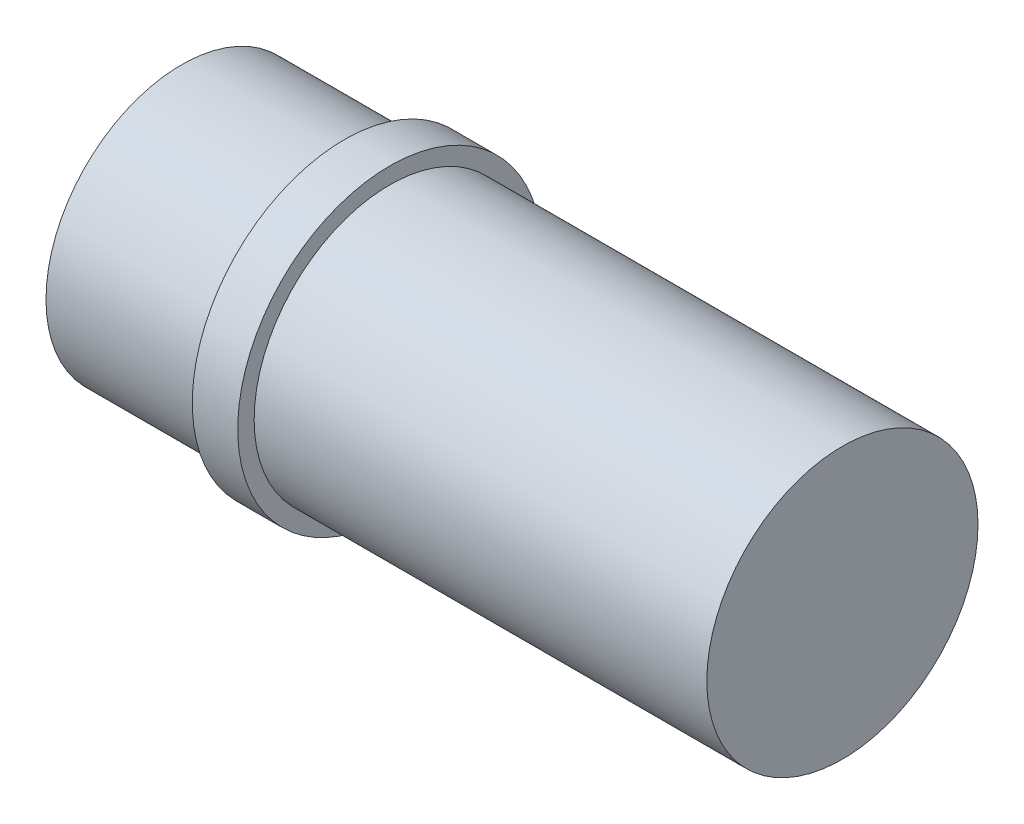
ISO-10303-21;
HEADER;
FILE_DESCRIPTION(('STEP AP214'),'2;1');
FILE_NAME('part.step','',(''),(''),'','','');
FILE_SCHEMA(('AUTOMOTIVE_DESIGN { 1 0 10303 214 1 1 1 1 }'));
ENDSEC;
DATA;
#1=APPLICATION_CONTEXT('core data for automotive mechanical design processes');
#2=APPLICATION_PROTOCOL_DEFINITION('international standard','automotive_design',2000,#1);
#3=PRODUCT_CONTEXT('',#1,'mechanical');
#4=PRODUCT('Part','Part','',(#3));
#5=PRODUCT_RELATED_PRODUCT_CATEGORY('part','',(#4));
#6=PRODUCT_DEFINITION_FORMATION('','',#4);
#7=PRODUCT_DEFINITION_CONTEXT('part definition',#1,'design');
#8=PRODUCT_DEFINITION('design','',#6,#7);
#9=PRODUCT_DEFINITION_SHAPE('','',#8);
#10=(LENGTH_UNIT() NAMED_UNIT(*) SI_UNIT(.MILLI.,.METRE.));
#11=(NAMED_UNIT(*) PLANE_ANGLE_UNIT() SI_UNIT($,.RADIAN.));
#12=(NAMED_UNIT(*) SI_UNIT($,.STERADIAN.) SOLID_ANGLE_UNIT());
#13=UNCERTAINTY_MEASURE_WITH_UNIT(LENGTH_MEASURE(1.E-05),#10,'distance_accuracy_value','');
#14=(GEOMETRIC_REPRESENTATION_CONTEXT(3) GLOBAL_UNCERTAINTY_ASSIGNED_CONTEXT((#13)) GLOBAL_UNIT_ASSIGNED_CONTEXT((#10,
#11,#12)) REPRESENTATION_CONTEXT('',''));
#15=CARTESIAN_POINT('',(0.,0.,0.));
#16=DIRECTION('',(0.,0.,1.));
#17=DIRECTION('',(1.,0.,0.));
#18=AXIS2_PLACEMENT_3D('',#15,#16,#17);
#19=CARTESIAN_POINT('',(29.245125,0.,0.));
#20=DIRECTION('',(-1.,0.,0.));
#21=DIRECTION('',(0.,0.,1.));
#22=AXIS2_PLACEMENT_3D('',#19,#20,#21);
#23=CYLINDRICAL_SURFACE('',#22,36.241875);
#24=CARTESIAN_POINT('',(29.245125,0.,0.));
#25=DIRECTION('',(1.,0.,0.));
#26=DIRECTION('',(0.,0.,-1.));
#27=AXIS2_PLACEMENT_3D('',#24,#25,#26);
#28=CIRCLE('',#27,36.241875);
#29=CARTESIAN_POINT('',(29.245125,0.,-36.241875));
#30=VERTEX_POINT('',#29);
#31=EDGE_CURVE('E40',#30,#30,#28,.T.);
#32=ORIENTED_EDGE('',*,*,#31,.F.);
#33=EDGE_LOOP('',(#32));
#34=FACE_BOUND('',#33,.T.);
#35=CARTESIAN_POINT('',(-14.245125,0.,0.));
#36=DIRECTION('',(1.,0.,0.));
#37=DIRECTION('',(0.,0.,-1.));
#38=AXIS2_PLACEMENT_3D('',#35,#36,#37);
#39=CIRCLE('',#38,36.241875);
#40=CARTESIAN_POINT('',(-14.245125,0.,-36.241875));
#41=VERTEX_POINT('',#40);
#42=EDGE_CURVE('E36',#41,#41,#39,.T.);
#43=ORIENTED_EDGE('',*,*,#42,.T.);
#44=EDGE_LOOP('',(#43));
#45=FACE_BOUND('',#44,.T.);
#46=ADVANCED_FACE('F33',(#34,#45),#23,.T.);
#47=CARTESIAN_POINT('',(-14.245125,0.,0.));
#48=DIRECTION('',(1.,0.,0.));
#49=DIRECTION('',(0.,0.,-1.));
#50=AXIS2_PLACEMENT_3D('',#47,#48,#49);
#51=PLANE('',#50);
#52=ORIENTED_EDGE('',*,*,#42,.F.);
#53=EDGE_LOOP('',(#52));
#54=FACE_BOUND('',#53,.T.);
#55=ADVANCED_FACE('F74',(#54),#51,.F.);
#56=CARTESIAN_POINT('',(41.3951174,0.,0.));
#57=DIRECTION('',(-1.,0.,0.));
#58=DIRECTION('',(0.,0.,1.));
#59=AXIS2_PLACEMENT_3D('',#56,#57,#58);
#60=CYLINDRICAL_SURFACE('',#59,40.6333777221703);
#61=CARTESIAN_POINT('',(41.3951174,0.,0.));
#62=DIRECTION('',(1.,0.,0.));
#63=DIRECTION('',(0.,0.,-1.));
#64=AXIS2_PLACEMENT_3D('',#61,#62,#63);
#65=CIRCLE('',#64,40.6333777221703);
#66=CARTESIAN_POINT('',(41.3951174,0.,-40.6333777221703));
#67=VERTEX_POINT('',#66);
#68=EDGE_CURVE('E48',#67,#67,#65,.T.);
#69=ORIENTED_EDGE('',*,*,#68,.F.);
#70=EDGE_LOOP('',(#69));
#71=FACE_BOUND('',#70,.T.);
#72=CARTESIAN_POINT('',(29.245125,0.,0.));
#73=DIRECTION('',(1.,0.,0.));
#74=DIRECTION('',(0.,0.,-1.));
#75=AXIS2_PLACEMENT_3D('',#72,#73,#74);
#76=CIRCLE('',#75,40.6333777221703);
#77=CARTESIAN_POINT('',(29.245125,0.,-40.6333777221703));
#78=VERTEX_POINT('',#77);
#79=EDGE_CURVE('E51',#78,#78,#76,.T.);
#80=ORIENTED_EDGE('',*,*,#79,.T.);
#81=EDGE_LOOP('',(#80));
#82=FACE_BOUND('',#81,.T.);
#83=ADVANCED_FACE('F79',(#71,#82),#60,.T.);
#84=CARTESIAN_POINT('',(41.3951174,0.,0.));
#85=DIRECTION('',(1.,0.,0.));
#86=DIRECTION('',(0.,0.,-1.));
#87=AXIS2_PLACEMENT_3D('',#84,#85,#86);
#88=PLANE('',#87);
#89=CARTESIAN_POINT('',(41.3951174,0.,0.));
#90=DIRECTION('',(1.,0.,0.));
#91=DIRECTION('',(0.,0.,-1.));
#92=AXIS2_PLACEMENT_3D('',#89,#90,#91);
#93=CIRCLE('',#92,36.241875);
#94=CARTESIAN_POINT('',(41.3951174,0.,-36.241875));
#95=VERTEX_POINT('',#94);
#96=EDGE_CURVE('E10',#95,#95,#93,.T.);
#97=ORIENTED_EDGE('',*,*,#96,.F.);
#98=EDGE_LOOP('',(#97));
#99=FACE_BOUND('',#98,.T.);
#100=ORIENTED_EDGE('',*,*,#68,.T.);
#101=EDGE_LOOP('',(#100));
#102=FACE_BOUND('',#101,.T.);
#103=ADVANCED_FACE('F69',(#99,#102),#88,.T.);
#104=CARTESIAN_POINT('',(29.245125,0.,0.));
#105=DIRECTION('',(1.,0.,0.));
#106=DIRECTION('',(0.,0.,-1.));
#107=AXIS2_PLACEMENT_3D('',#104,#105,#106);
#108=PLANE('',#107);
#109=ORIENTED_EDGE('',*,*,#31,.T.);
#110=EDGE_LOOP('',(#109));
#111=FACE_BOUND('',#110,.T.);
#112=ORIENTED_EDGE('',*,*,#79,.F.);
#113=EDGE_LOOP('',(#112));
#114=FACE_BOUND('',#113,.T.);
#115=ADVANCED_FACE('F62',(#111,#114),#108,.F.);
#116=CARTESIAN_POINT('',(91.3951174,0.,0.));
#117=DIRECTION('',(-1.,0.,0.));
#118=DIRECTION('',(0.,0.,1.));
#119=AXIS2_PLACEMENT_3D('',#116,#117,#118);
#120=CYLINDRICAL_SURFACE('',#119,36.241875);
#121=ORIENTED_EDGE('',*,*,#96,.T.);
#122=EDGE_LOOP('',(#121));
#123=FACE_BOUND('',#122,.T.);
#124=CARTESIAN_POINT('',(162.3951174,0.,0.));
#125=DIRECTION('',(1.,0.,0.));
#126=DIRECTION('',(0.,0.,-1.));
#127=AXIS2_PLACEMENT_3D('',#124,#125,#126);
#128=CIRCLE('',#127,36.241875);
#129=CARTESIAN_POINT('',(162.3951174,0.,-36.241875));
#130=VERTEX_POINT('',#129);
#131=EDGE_CURVE('E47',#130,#130,#128,.T.);
#132=ORIENTED_EDGE('',*,*,#131,.F.);
#133=EDGE_LOOP('',(#132));
#134=FACE_BOUND('',#133,.T.);
#135=ADVANCED_FACE('F60',(#123,#134),#120,.T.);
#136=CARTESIAN_POINT('',(162.3951174,0.,0.));
#137=DIRECTION('',(1.,0.,0.));
#138=DIRECTION('',(0.,0.,-1.));
#139=AXIS2_PLACEMENT_3D('',#136,#137,#138);
#140=PLANE('',#139);
#141=ORIENTED_EDGE('',*,*,#131,.T.);
#142=EDGE_LOOP('',(#141));
#143=FACE_BOUND('',#142,.T.);
#144=ADVANCED_FACE('F58',(#143),#140,.T.);
#145=CLOSED_SHELL('',(#46,#55,#83,#103,#115,#135,#144));
#146=MANIFOLD_SOLID_BREP('B2',#145);
#147=ADVANCED_BREP_SHAPE_REPRESENTATION('',(#18,#146),#14);
#148=SHAPE_DEFINITION_REPRESENTATION(#9,#147);
ENDSEC;
END-ISO-10303-21;
